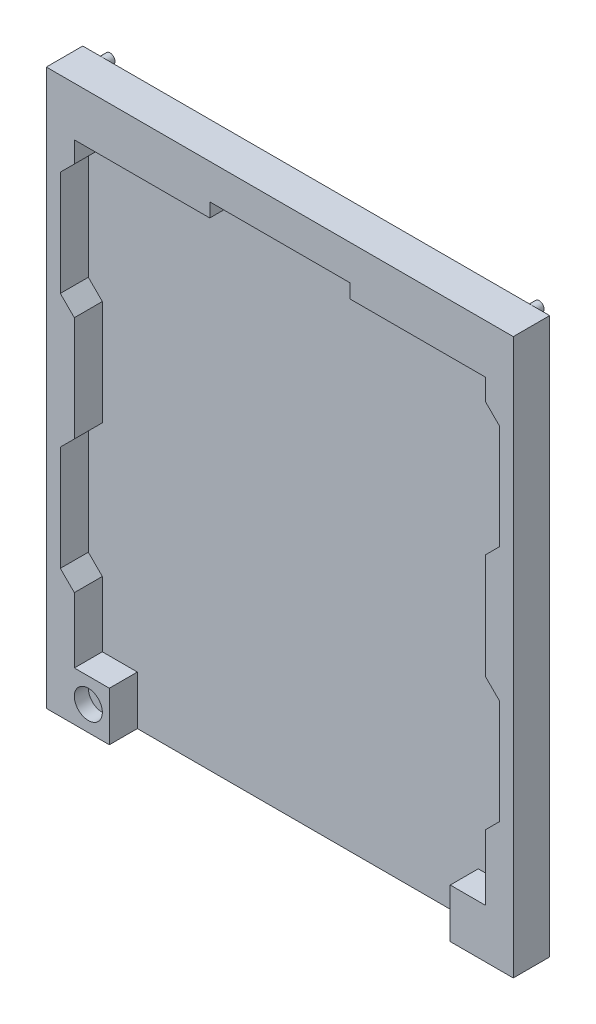
ISO-10303-21;
HEADER;
FILE_DESCRIPTION(('STEP AP214'),'2;1');
FILE_NAME('part.step','',(''),(''),'','','');
FILE_SCHEMA(('AUTOMOTIVE_DESIGN { 1 0 10303 214 1 1 1 1 }'));
ENDSEC;
DATA;
#1=APPLICATION_CONTEXT('core data for automotive mechanical design processes');
#2=APPLICATION_PROTOCOL_DEFINITION('international standard','automotive_design',2000,#1);
#3=PRODUCT_CONTEXT('',#1,'mechanical');
#4=PRODUCT('Part','Part','',(#3));
#5=PRODUCT_RELATED_PRODUCT_CATEGORY('part','',(#4));
#6=PRODUCT_DEFINITION_FORMATION('','',#4);
#7=PRODUCT_DEFINITION_CONTEXT('part definition',#1,'design');
#8=PRODUCT_DEFINITION('design','',#6,#7);
#9=PRODUCT_DEFINITION_SHAPE('','',#8);
#10=(LENGTH_UNIT() NAMED_UNIT(*) SI_UNIT(.MILLI.,.METRE.));
#11=(NAMED_UNIT(*) PLANE_ANGLE_UNIT() SI_UNIT($,.RADIAN.));
#12=(NAMED_UNIT(*) SI_UNIT($,.STERADIAN.) SOLID_ANGLE_UNIT());
#13=UNCERTAINTY_MEASURE_WITH_UNIT(LENGTH_MEASURE(1.E-05),#10,'distance_accuracy_value','');
#14=(GEOMETRIC_REPRESENTATION_CONTEXT(3) GLOBAL_UNCERTAINTY_ASSIGNED_CONTEXT((#13)) GLOBAL_UNIT_ASSIGNED_CONTEXT((#10,
#11,#12)) REPRESENTATION_CONTEXT('',''));
#15=CARTESIAN_POINT('',(0.,0.,0.));
#16=DIRECTION('',(0.,0.,1.));
#17=DIRECTION('',(1.,0.,0.));
#18=AXIS2_PLACEMENT_3D('',#15,#16,#17);
#19=CARTESIAN_POINT('',(0.,0.,0.6));
#20=DIRECTION('',(0.,0.,1.));
#21=DIRECTION('',(1.,0.,0.));
#22=AXIS2_PLACEMENT_3D('',#19,#20,#21);
#23=PLANE('',#22);
#24=DIRECTION('',(1.,0.,0.));
#25=VECTOR('',#24,1.);
#26=CARTESIAN_POINT('',(-33.34,0.,0.6));
#27=LINE('',#26,#25);
#28=CARTESIAN_POINT('',(-28.84,0.,0.6));
#29=VERTEX_POINT('',#28);
#30=CARTESIAN_POINT('',(-4.5,0.,0.6));
#31=VERTEX_POINT('',#30);
#32=EDGE_CURVE('E594',#29,#31,#27,.T.);
#33=ORIENTED_EDGE('',*,*,#32,.T.);
#34=DIRECTION('',(0.,-1.,0.));
#35=VECTOR('',#34,1.);
#36=CARTESIAN_POINT('',(-4.5,0.,0.6));
#37=LINE('',#36,#35);
#38=CARTESIAN_POINT('',(-4.5,3.5,0.6));
#39=VERTEX_POINT('',#38);
#40=EDGE_CURVE('E726',#39,#31,#37,.T.);
#41=ORIENTED_EDGE('',*,*,#40,.F.);
#42=DIRECTION('',(-1.,0.,0.));
#43=VECTOR('',#42,1.);
#44=CARTESIAN_POINT('',(0.,3.5,0.6));
#45=LINE('',#44,#43);
#46=CARTESIAN_POINT('',(-2.,3.5,0.6));
#47=VERTEX_POINT('',#46);
#48=EDGE_CURVE('E722',#47,#39,#45,.T.);
#49=ORIENTED_EDGE('',*,*,#48,.F.);
#50=DIRECTION('',(0.,-1.,0.));
#51=VECTOR('',#50,1.);
#52=CARTESIAN_POINT('',(-1.99999999999999,0.,0.6));
#53=LINE('',#52,#51);
#54=CARTESIAN_POINT('',(-2.,8.16000000000001,0.6));
#55=VERTEX_POINT('',#54);
#56=EDGE_CURVE('E718',#55,#47,#53,.T.);
#57=ORIENTED_EDGE('',*,*,#56,.F.);
#58=DIRECTION('',(-0.707106781186549,-0.707106781186547,0.));
#59=VECTOR('',#58,1.);
#60=CARTESIAN_POINT('',(-5.08,5.08000000000001,0.6));
#61=LINE('',#60,#59);
#62=CARTESIAN_POINT('',(-0.999999999999996,9.16,0.6));
#63=VERTEX_POINT('',#62);
#64=EDGE_CURVE('E634',#63,#55,#61,.T.);
#65=ORIENTED_EDGE('',*,*,#64,.F.);
#66=DIRECTION('',(0.,-1.,0.));
#67=VECTOR('',#66,1.);
#68=CARTESIAN_POINT('',(-0.999999999999995,0.,0.6));
#69=LINE('',#68,#67);
#70=CARTESIAN_POINT('',(-0.999999999999997,16.66,0.6));
#71=VERTEX_POINT('',#70);
#72=EDGE_CURVE('E630',#71,#63,#69,.T.);
#73=ORIENTED_EDGE('',*,*,#72,.F.);
#74=DIRECTION('',(0.707106781186549,-0.707106781186546,0.));
#75=VECTOR('',#74,1.);
#76=CARTESIAN_POINT('',(7.83,7.83000000000003,0.6));
#77=LINE('',#76,#75);
#78=CARTESIAN_POINT('',(-1.99999999999999,17.66,0.6));
#79=VERTEX_POINT('',#78);
#80=EDGE_CURVE('E624',#79,#71,#77,.T.);
#81=ORIENTED_EDGE('',*,*,#80,.F.);
#82=DIRECTION('',(0.,-1.,0.));
#83=VECTOR('',#82,1.);
#84=CARTESIAN_POINT('',(-1.99999999999998,0.,0.6));
#85=LINE('',#84,#83);
#86=CARTESIAN_POINT('',(-1.99999999999999,25.16,0.6));
#87=VERTEX_POINT('',#86);
#88=EDGE_CURVE('E620',#87,#79,#85,.T.);
#89=ORIENTED_EDGE('',*,*,#88,.F.);
#90=DIRECTION('',(-0.707106781186546,-0.707106781186549,0.));
#91=VECTOR('',#90,1.);
#92=CARTESIAN_POINT('',(-13.58,13.5799999999999,0.6));
#93=LINE('',#92,#91);
#94=CARTESIAN_POINT('',(-0.999999999999999,26.16,0.6));
#95=VERTEX_POINT('',#94);
#96=EDGE_CURVE('E625',#95,#87,#93,.T.);
#97=ORIENTED_EDGE('',*,*,#96,.F.);
#98=DIRECTION('',(0.,-1.,0.));
#99=VECTOR('',#98,1.);
#100=CARTESIAN_POINT('',(-0.999999999999997,0.,0.6));
#101=LINE('',#100,#99);
#102=CARTESIAN_POINT('',(-0.999999999999999,33.66,0.6));
#103=VERTEX_POINT('',#102);
#104=EDGE_CURVE('E732',#103,#95,#101,.T.);
#105=ORIENTED_EDGE('',*,*,#104,.F.);
#106=DIRECTION('',(-0.707106781186543,0.707106781186552,0.));
#107=VECTOR('',#106,1.);
#108=CARTESIAN_POINT('',(16.33,16.3299999999998,0.6));
#109=LINE('',#108,#107);
#110=CARTESIAN_POINT('',(-2.,34.66,0.6));
#111=VERTEX_POINT('',#110);
#112=EDGE_CURVE('E329',#103,#111,#109,.T.);
#113=ORIENTED_EDGE('',*,*,#112,.T.);
#114=DIRECTION('',(0.,-1.,0.));
#115=VECTOR('',#114,1.);
#116=CARTESIAN_POINT('',(-2.00000000000005,0.,0.6));
#117=LINE('',#116,#115);
#118=CARTESIAN_POINT('',(-2.,36.16,0.6));
#119=VERTEX_POINT('',#118);
#120=EDGE_CURVE('E351',#119,#111,#117,.T.);
#121=ORIENTED_EDGE('',*,*,#120,.F.);
#122=DIRECTION('',(-1.,0.,0.));
#123=VECTOR('',#122,1.);
#124=CARTESIAN_POINT('',(0.,36.16,0.6));
#125=LINE('',#124,#123);
#126=CARTESIAN_POINT('',(-11.67,36.16,0.6));
#127=VERTEX_POINT('',#126);
#128=EDGE_CURVE('E67',#119,#127,#125,.T.);
#129=ORIENTED_EDGE('',*,*,#128,.T.);
#130=DIRECTION('',(0.,1.,0.));
#131=VECTOR('',#130,1.);
#132=CARTESIAN_POINT('',(-11.67,0.,0.6));
#133=LINE('',#132,#131);
#134=CARTESIAN_POINT('',(-11.67,37.16,0.6));
#135=VERTEX_POINT('',#134);
#136=EDGE_CURVE('E978',#127,#135,#133,.T.);
#137=ORIENTED_EDGE('',*,*,#136,.T.);
#138=DIRECTION('',(-1.,0.,0.));
#139=VECTOR('',#138,1.);
#140=CARTESIAN_POINT('',(0.,37.16,0.6));
#141=LINE('',#140,#139);
#142=CARTESIAN_POINT('',(-21.67,37.16,0.6));
#143=VERTEX_POINT('',#142);
#144=EDGE_CURVE('E983',#135,#143,#141,.T.);
#145=ORIENTED_EDGE('',*,*,#144,.T.);
#146=DIRECTION('',(0.,1.,0.));
#147=VECTOR('',#146,1.);
#148=CARTESIAN_POINT('',(-21.67,0.,0.6));
#149=LINE('',#148,#147);
#150=CARTESIAN_POINT('',(-21.67,36.16,0.6));
#151=VERTEX_POINT('',#150);
#152=EDGE_CURVE('E989',#151,#143,#149,.T.);
#153=ORIENTED_EDGE('',*,*,#152,.F.);
#154=DIRECTION('',(1.,0.,0.));
#155=VECTOR('',#154,1.);
#156=CARTESIAN_POINT('',(0.,36.16,0.6));
#157=LINE('',#156,#155);
#158=CARTESIAN_POINT('',(-31.34,36.16,0.6));
#159=VERTEX_POINT('',#158);
#160=EDGE_CURVE('E1006',#159,#151,#157,.T.);
#161=ORIENTED_EDGE('',*,*,#160,.F.);
#162=DIRECTION('',(0.,-1.,0.));
#163=VECTOR('',#162,1.);
#164=CARTESIAN_POINT('',(-31.34,0.,0.6));
#165=LINE('',#164,#163);
#166=CARTESIAN_POINT('',(-31.34,34.66,0.6));
#167=VERTEX_POINT('',#166);
#168=EDGE_CURVE('E1010',#159,#167,#165,.T.);
#169=ORIENTED_EDGE('',*,*,#168,.T.);
#170=DIRECTION('',(0.707106781186548,0.707106781186548,0.));
#171=VECTOR('',#170,1.);
#172=CARTESIAN_POINT('',(-33.,33.,0.6));
#173=LINE('',#172,#171);
#174=CARTESIAN_POINT('',(-32.34,33.66,0.6));
#175=VERTEX_POINT('',#174);
#176=EDGE_CURVE('E1015',#175,#167,#173,.T.);
#177=ORIENTED_EDGE('',*,*,#176,.F.);
#178=DIRECTION('',(0.,1.,0.));
#179=VECTOR('',#178,1.);
#180=CARTESIAN_POINT('',(-32.34,0.,0.6));
#181=LINE('',#180,#179);
#182=CARTESIAN_POINT('',(-32.34,26.16,0.6));
#183=VERTEX_POINT('',#182);
#184=EDGE_CURVE('E1021',#183,#175,#181,.T.);
#185=ORIENTED_EDGE('',*,*,#184,.F.);
#186=DIRECTION('',(-0.707106781186549,0.707106781186546,0.));
#187=VECTOR('',#186,1.);
#188=CARTESIAN_POINT('',(-3.08999999999995,-3.08999999999996,0.6));
#189=LINE('',#188,#187);
#190=CARTESIAN_POINT('',(-31.34,25.16,0.6));
#191=VERTEX_POINT('',#190);
#192=EDGE_CURVE('E1024',#191,#183,#189,.T.);
#193=ORIENTED_EDGE('',*,*,#192,.F.);
#194=DIRECTION('',(0.,1.,0.));
#195=VECTOR('',#194,1.);
#196=CARTESIAN_POINT('',(-31.34,0.,0.6));
#197=LINE('',#196,#195);
#198=CARTESIAN_POINT('',(-31.34,17.66,0.6));
#199=VERTEX_POINT('',#198);
#200=EDGE_CURVE('E934',#199,#191,#197,.T.);
#201=ORIENTED_EDGE('',*,*,#200,.F.);
#202=DIRECTION('',(0.707106781186552,0.707106781186543,0.));
#203=VECTOR('',#202,1.);
#204=CARTESIAN_POINT('',(-24.4999999999998,24.5000000000001,0.6));
#205=LINE('',#204,#203);
#206=CARTESIAN_POINT('',(-32.34,16.66,0.6));
#207=VERTEX_POINT('',#206);
#208=EDGE_CURVE('E930',#207,#199,#205,.T.);
#209=ORIENTED_EDGE('',*,*,#208,.F.);
#210=DIRECTION('',(0.,1.,0.));
#211=VECTOR('',#210,1.);
#212=CARTESIAN_POINT('',(-32.34,0.,0.6));
#213=LINE('',#212,#211);
#214=CARTESIAN_POINT('',(-32.34,9.15999999999999,0.6));
#215=VERTEX_POINT('',#214);
#216=EDGE_CURVE('E926',#215,#207,#213,.T.);
#217=ORIENTED_EDGE('',*,*,#216,.F.);
#218=DIRECTION('',(-0.707106781186551,0.707106781186544,0.));
#219=VECTOR('',#218,1.);
#220=CARTESIAN_POINT('',(-11.5899999999998,-11.59,0.6));
#221=LINE('',#220,#219);
#222=CARTESIAN_POINT('',(-31.34,8.16000000000001,0.6));
#223=VERTEX_POINT('',#222);
#224=EDGE_CURVE('E862',#223,#215,#221,.T.);
#225=ORIENTED_EDGE('',*,*,#224,.F.);
#226=DIRECTION('',(0.,1.,0.));
#227=VECTOR('',#226,1.);
#228=CARTESIAN_POINT('',(-31.34,0.,0.6));
#229=LINE('',#228,#227);
#230=CARTESIAN_POINT('',(-31.34,3.5,0.6));
#231=VERTEX_POINT('',#230);
#232=EDGE_CURVE('E858',#231,#223,#229,.T.);
#233=ORIENTED_EDGE('',*,*,#232,.F.);
#234=DIRECTION('',(-1.,0.,0.));
#235=VECTOR('',#234,1.);
#236=CARTESIAN_POINT('',(0.,3.49999999999999,0.6));
#237=LINE('',#236,#235);
#238=CARTESIAN_POINT('',(-28.84,3.5,0.6));
#239=VERTEX_POINT('',#238);
#240=EDGE_CURVE('E854',#239,#231,#237,.T.);
#241=ORIENTED_EDGE('',*,*,#240,.F.);
#242=DIRECTION('',(0.,1.,0.));
#243=VECTOR('',#242,1.);
#244=CARTESIAN_POINT('',(-28.84,0.,0.6));
#245=LINE('',#244,#243);
#246=EDGE_CURVE('E851',#29,#239,#245,.T.);
#247=ORIENTED_EDGE('',*,*,#246,.F.);
#248=EDGE_LOOP('',(#33,#41,#49,#57,#65,#73,#81,#89,#97,#105,#113,#121,#129,#137,#145,#153,#161,
#169,#177,#185,#193,#201,#209,#217,#225,#233,#241,#247));
#249=FACE_BOUND('',#248,.T.);
#250=ADVANCED_FACE('F47',(#249),#23,.T.);
#251=CARTESIAN_POINT('',(-33.34,39.66,0.6));
#252=DIRECTION('',(1.,0.,0.));
#253=DIRECTION('',(0.,1.,0.));
#254=AXIS2_PLACEMENT_3D('',#251,#252,#253);
#255=PLANE('',#254);
#256=DIRECTION('',(0.,-1.,0.));
#257=VECTOR('',#256,1.);
#258=CARTESIAN_POINT('',(-33.34,39.66,0.));
#259=LINE('',#258,#257);
#260=CARTESIAN_POINT('',(-33.34,39.66,0.));
#261=VERTEX_POINT('',#260);
#262=CARTESIAN_POINT('',(-33.34,0.,0.));
#263=VERTEX_POINT('',#262);
#264=EDGE_CURVE('E333',#261,#263,#259,.T.);
#265=ORIENTED_EDGE('',*,*,#264,.T.);
#266=DIRECTION('',(0.,0.,-1.));
#267=VECTOR('',#266,1.);
#268=CARTESIAN_POINT('',(-33.34,0.,0.6));
#269=LINE('',#268,#267);
#270=CARTESIAN_POINT('',(-33.34,0.,2.6));
#271=VERTEX_POINT('',#270);
#272=EDGE_CURVE('E576',#271,#263,#269,.T.);
#273=ORIENTED_EDGE('',*,*,#272,.F.);
#274=DIRECTION('',(0.,-1.,0.));
#275=VECTOR('',#274,1.);
#276=CARTESIAN_POINT('',(-33.34,0.,2.6));
#277=LINE('',#276,#275);
#278=CARTESIAN_POINT('',(-33.34,39.66,2.6));
#279=VERTEX_POINT('',#278);
#280=EDGE_CURVE('E819',#279,#271,#277,.T.);
#281=ORIENTED_EDGE('',*,*,#280,.F.);
#282=DIRECTION('',(0.,0.,-1.));
#283=VECTOR('',#282,1.);
#284=CARTESIAN_POINT('',(-33.34,39.66,0.6));
#285=LINE('',#284,#283);
#286=EDGE_CURVE('E610',#279,#261,#285,.T.);
#287=ORIENTED_EDGE('',*,*,#286,.T.);
#288=EDGE_LOOP('',(#265,#273,#281,#287));
#289=FACE_BOUND('',#288,.T.);
#290=ADVANCED_FACE('F50',(#289),#255,.F.);
#291=CARTESIAN_POINT('',(-33.34,0.,0.6));
#292=DIRECTION('',(0.,1.,0.));
#293=DIRECTION('',(0.,0.,1.));
#294=AXIS2_PLACEMENT_3D('',#291,#292,#293);
#295=PLANE('',#294);
#296=DIRECTION('',(1.,0.,0.));
#297=VECTOR('',#296,1.);
#298=CARTESIAN_POINT('',(-33.34,0.,0.));
#299=LINE('',#298,#297);
#300=CARTESIAN_POINT('',(0.,0.,0.));
#301=VERTEX_POINT('',#300);
#302=EDGE_CURVE('E570',#263,#301,#299,.T.);
#303=ORIENTED_EDGE('',*,*,#302,.T.);
#304=DIRECTION('',(0.,0.,-1.));
#305=VECTOR('',#304,1.);
#306=CARTESIAN_POINT('',(0.,0.,0.6));
#307=LINE('',#306,#305);
#308=CARTESIAN_POINT('',(0.,0.,2.6));
#309=VERTEX_POINT('',#308);
#310=EDGE_CURVE('E573',#309,#301,#307,.T.);
#311=ORIENTED_EDGE('',*,*,#310,.F.);
#312=DIRECTION('',(1.,0.,0.));
#313=VECTOR('',#312,1.);
#314=CARTESIAN_POINT('',(0.,0.,2.6));
#315=LINE('',#314,#313);
#316=CARTESIAN_POINT('',(-4.5,0.,2.6));
#317=VERTEX_POINT('',#316);
#318=EDGE_CURVE('E691',#317,#309,#315,.T.);
#319=ORIENTED_EDGE('',*,*,#318,.F.);
#320=DIRECTION('',(0.,0.,-1.));
#321=VECTOR('',#320,1.);
#322=CARTESIAN_POINT('',(-4.5,0.,2.6));
#323=LINE('',#322,#321);
#324=EDGE_CURVE('E755',#317,#31,#323,.T.);
#325=ORIENTED_EDGE('',*,*,#324,.T.);
#326=ORIENTED_EDGE('',*,*,#32,.F.);
#327=DIRECTION('',(0.,0.,-1.));
#328=VECTOR('',#327,1.);
#329=CARTESIAN_POINT('',(-28.84,0.,2.6));
#330=LINE('',#329,#328);
#331=CARTESIAN_POINT('',(-28.84,0.,2.6));
#332=VERTEX_POINT('',#331);
#333=EDGE_CURVE('E810',#332,#29,#330,.T.);
#334=ORIENTED_EDGE('',*,*,#333,.F.);
#335=EDGE_CURVE('E695',#271,#332,#315,.T.);
#336=ORIENTED_EDGE('',*,*,#335,.F.);
#337=ORIENTED_EDGE('',*,*,#272,.T.);
#338=EDGE_LOOP('',(#303,#311,#319,#325,#326,#334,#336,#337));
#339=FACE_BOUND('',#338,.T.);
#340=ADVANCED_FACE('F538',(#339),#295,.F.);
#341=CARTESIAN_POINT('',(0.,39.66,0.6));
#342=DIRECTION('',(-1.,0.,0.));
#343=DIRECTION('',(0.,-1.,0.));
#344=AXIS2_PLACEMENT_3D('',#341,#342,#343);
#345=PLANE('',#344);
#346=DIRECTION('',(0.,1.,0.));
#347=VECTOR('',#346,1.);
#348=CARTESIAN_POINT('',(0.,39.66,0.));
#349=LINE('',#348,#347);
#350=CARTESIAN_POINT('',(0.,39.66,0.));
#351=VERTEX_POINT('',#350);
#352=EDGE_CURVE('E582',#301,#351,#349,.T.);
#353=ORIENTED_EDGE('',*,*,#352,.T.);
#354=DIRECTION('',(0.,0.,-1.));
#355=VECTOR('',#354,1.);
#356=CARTESIAN_POINT('',(0.,39.66,0.6));
#357=LINE('',#356,#355);
#358=CARTESIAN_POINT('',(0.,39.66,2.6));
#359=VERTEX_POINT('',#358);
#360=EDGE_CURVE('E588',#359,#351,#357,.T.);
#361=ORIENTED_EDGE('',*,*,#360,.F.);
#362=DIRECTION('',(0.,1.,0.));
#363=VECTOR('',#362,1.);
#364=CARTESIAN_POINT('',(0.,0.,2.6));
#365=LINE('',#364,#363);
#366=EDGE_CURVE('E586',#309,#359,#365,.T.);
#367=ORIENTED_EDGE('',*,*,#366,.F.);
#368=ORIENTED_EDGE('',*,*,#310,.T.);
#369=EDGE_LOOP('',(#353,#361,#367,#368));
#370=FACE_BOUND('',#369,.T.);
#371=ADVANCED_FACE('F557',(#370),#345,.F.);
#372=CARTESIAN_POINT('',(-33.34,39.66,0.6));
#373=DIRECTION('',(0.,-1.,0.));
#374=DIRECTION('',(1.,0.,0.));
#375=AXIS2_PLACEMENT_3D('',#372,#373,#374);
#376=PLANE('',#375);
#377=DIRECTION('',(-1.,0.,0.));
#378=VECTOR('',#377,1.);
#379=CARTESIAN_POINT('',(-33.34,39.66,0.));
#380=LINE('',#379,#378);
#381=EDGE_CURVE('E78',#351,#261,#380,.T.);
#382=ORIENTED_EDGE('',*,*,#381,.T.);
#383=ORIENTED_EDGE('',*,*,#286,.F.);
#384=DIRECTION('',(-1.,0.,0.));
#385=VECTOR('',#384,1.);
#386=CARTESIAN_POINT('',(0.,39.66,2.6));
#387=LINE('',#386,#385);
#388=EDGE_CURVE('E815',#359,#279,#387,.T.);
#389=ORIENTED_EDGE('',*,*,#388,.F.);
#390=ORIENTED_EDGE('',*,*,#360,.T.);
#391=EDGE_LOOP('',(#382,#383,#389,#390));
#392=FACE_BOUND('',#391,.T.);
#393=ADVANCED_FACE('F551',(#392),#376,.F.);
#394=CARTESIAN_POINT('',(0.,0.,0.));
#395=DIRECTION('',(0.,0.,1.));
#396=DIRECTION('',(1.,0.,0.));
#397=AXIS2_PLACEMENT_3D('',#394,#395,#396);
#398=PLANE('',#397);
#399=CARTESIAN_POINT('',(-31.99,39.26,0.));
#400=DIRECTION('',(0.,0.,1.));
#401=DIRECTION('',(1.,0.,0.));
#402=AXIS2_PLACEMENT_3D('',#399,#400,#401);
#403=CIRCLE('',#402,0.350000000000002);
#404=CARTESIAN_POINT('',(-31.64,39.26,0.));
#405=VERTEX_POINT('',#404);
#406=EDGE_CURVE('E12',#405,#405,#403,.F.);
#407=ORIENTED_EDGE('',*,*,#406,.F.);
#408=EDGE_LOOP('',(#407));
#409=FACE_BOUND('',#408,.T.);
#410=CARTESIAN_POINT('',(-1.35,39.26,0.));
#411=DIRECTION('',(0.,0.,1.));
#412=DIRECTION('',(1.,0.,0.));
#413=AXIS2_PLACEMENT_3D('',#410,#411,#412);
#414=CIRCLE('',#413,0.350000000000002);
#415=CARTESIAN_POINT('',(-0.999999999999998,39.26,0.));
#416=VERTEX_POINT('',#415);
#417=EDGE_CURVE('E57',#416,#416,#414,.F.);
#418=ORIENTED_EDGE('',*,*,#417,.F.);
#419=EDGE_LOOP('',(#418));
#420=FACE_BOUND('',#419,.T.);
#421=ORIENTED_EDGE('',*,*,#264,.F.);
#422=ORIENTED_EDGE('',*,*,#381,.F.);
#423=ORIENTED_EDGE('',*,*,#352,.F.);
#424=ORIENTED_EDGE('',*,*,#302,.F.);
#425=EDGE_LOOP('',(#421,#422,#423,#424));
#426=FACE_BOUND('',#425,.T.);
#427=ADVANCED_FACE('F547',(#409,#420,#426),#398,.F.);
#428=CARTESIAN_POINT('',(16.33,16.3299999999998,2.6));
#429=DIRECTION('',(-0.707106781186552,-0.707106781186543,0.));
#430=DIRECTION('',(0.707106781186543,-0.707106781186552,0.));
#431=AXIS2_PLACEMENT_3D('',#428,#429,#430);
#432=PLANE('',#431);
#433=ORIENTED_EDGE('',*,*,#112,.F.);
#434=DIRECTION('',(0.,0.,-1.));
#435=VECTOR('',#434,1.);
#436=CARTESIAN_POINT('',(-0.999999999999999,33.66,2.6));
#437=LINE('',#436,#435);
#438=CARTESIAN_POINT('',(-0.999999999999999,33.66,2.6));
#439=VERTEX_POINT('',#438);
#440=EDGE_CURVE('E323',#439,#103,#437,.T.);
#441=ORIENTED_EDGE('',*,*,#440,.F.);
#442=DIRECTION('',(-0.707106781186543,0.707106781186552,0.));
#443=VECTOR('',#442,1.);
#444=CARTESIAN_POINT('',(16.33,16.3299999999998,2.6));
#445=LINE('',#444,#443);
#446=CARTESIAN_POINT('',(-2.,34.66,2.6));
#447=VERTEX_POINT('',#446);
#448=EDGE_CURVE('E327',#439,#447,#445,.T.);
#449=ORIENTED_EDGE('',*,*,#448,.T.);
#450=DIRECTION('',(0.,0.,-1.));
#451=VECTOR('',#450,1.);
#452=CARTESIAN_POINT('',(-2.,34.66,2.6));
#453=LINE('',#452,#451);
#454=EDGE_CURVE('E372',#447,#111,#453,.T.);
#455=ORIENTED_EDGE('',*,*,#454,.T.);
#456=EDGE_LOOP('',(#433,#441,#449,#455));
#457=FACE_BOUND('',#456,.T.);
#458=ADVANCED_FACE('F325',(#457),#432,.T.);
#459=CARTESIAN_POINT('',(-0.999999999999997,0.,2.6));
#460=DIRECTION('',(1.,0.,0.));
#461=DIRECTION('',(0.,1.,0.));
#462=AXIS2_PLACEMENT_3D('',#459,#460,#461);
#463=PLANE('',#462);
#464=ORIENTED_EDGE('',*,*,#104,.T.);
#465=DIRECTION('',(0.,0.,-1.));
#466=VECTOR('',#465,1.);
#467=CARTESIAN_POINT('',(-0.999999999999999,26.16,2.6));
#468=LINE('',#467,#466);
#469=CARTESIAN_POINT('',(-0.999999999999999,26.16,2.6));
#470=VERTEX_POINT('',#469);
#471=EDGE_CURVE('E334',#470,#95,#468,.T.);
#472=ORIENTED_EDGE('',*,*,#471,.F.);
#473=DIRECTION('',(0.,-1.,0.));
#474=VECTOR('',#473,1.);
#475=CARTESIAN_POINT('',(-0.999999999999997,0.,2.6));
#476=LINE('',#475,#474);
#477=EDGE_CURVE('E337',#439,#470,#476,.T.);
#478=ORIENTED_EDGE('',*,*,#477,.F.);
#479=ORIENTED_EDGE('',*,*,#440,.T.);
#480=EDGE_LOOP('',(#464,#472,#478,#479));
#481=FACE_BOUND('',#480,.T.);
#482=ADVANCED_FACE('F338',(#481),#463,.F.);
#483=CARTESIAN_POINT('',(-13.58,13.5799999999999,2.6));
#484=DIRECTION('',(0.707106781186549,-0.707106781186546,0.));
#485=DIRECTION('',(0.707106781186546,0.707106781186549,0.));
#486=AXIS2_PLACEMENT_3D('',#483,#484,#485);
#487=PLANE('',#486);
#488=ORIENTED_EDGE('',*,*,#96,.T.);
#489=DIRECTION('',(0.,0.,-1.));
#490=VECTOR('',#489,1.);
#491=CARTESIAN_POINT('',(-1.99999999999999,25.16,2.6));
#492=LINE('',#491,#490);
#493=CARTESIAN_POINT('',(-1.99999999999999,25.16,2.6));
#494=VERTEX_POINT('',#493);
#495=EDGE_CURVE('E713',#494,#87,#492,.T.);
#496=ORIENTED_EDGE('',*,*,#495,.F.);
#497=DIRECTION('',(-0.707106781186546,-0.707106781186549,0.));
#498=VECTOR('',#497,1.);
#499=CARTESIAN_POINT('',(-13.58,13.5799999999999,2.6));
#500=LINE('',#499,#498);
#501=EDGE_CURVE('E343',#470,#494,#500,.T.);
#502=ORIENTED_EDGE('',*,*,#501,.F.);
#503=ORIENTED_EDGE('',*,*,#471,.T.);
#504=EDGE_LOOP('',(#488,#496,#502,#503));
#505=FACE_BOUND('',#504,.T.);
#506=ADVANCED_FACE('F772',(#505),#487,.F.);
#507=CARTESIAN_POINT('',(-1.99999999999998,0.,2.6));
#508=DIRECTION('',(1.,0.,0.));
#509=DIRECTION('',(0.,1.,0.));
#510=AXIS2_PLACEMENT_3D('',#507,#508,#509);
#511=PLANE('',#510);
#512=ORIENTED_EDGE('',*,*,#88,.T.);
#513=DIRECTION('',(0.,0.,-1.));
#514=VECTOR('',#513,1.);
#515=CARTESIAN_POINT('',(-1.99999999999999,17.66,2.6));
#516=LINE('',#515,#514);
#517=CARTESIAN_POINT('',(-1.99999999999999,17.66,2.6));
#518=VERTEX_POINT('',#517);
#519=EDGE_CURVE('E657',#518,#79,#516,.T.);
#520=ORIENTED_EDGE('',*,*,#519,.F.);
#521=DIRECTION('',(0.,-1.,0.));
#522=VECTOR('',#521,1.);
#523=CARTESIAN_POINT('',(-1.99999999999998,0.,2.6));
#524=LINE('',#523,#522);
#525=EDGE_CURVE('E664',#494,#518,#524,.T.);
#526=ORIENTED_EDGE('',*,*,#525,.F.);
#527=ORIENTED_EDGE('',*,*,#495,.T.);
#528=EDGE_LOOP('',(#512,#520,#526,#527));
#529=FACE_BOUND('',#528,.T.);
#530=ADVANCED_FACE('F776',(#529),#511,.F.);
#531=CARTESIAN_POINT('',(7.83,7.83000000000003,2.6));
#532=DIRECTION('',(0.707106781186546,0.707106781186549,0.));
#533=DIRECTION('',(-0.707106781186549,0.707106781186546,0.));
#534=AXIS2_PLACEMENT_3D('',#531,#532,#533);
#535=PLANE('',#534);
#536=ORIENTED_EDGE('',*,*,#80,.T.);
#537=DIRECTION('',(0.,0.,-1.));
#538=VECTOR('',#537,1.);
#539=CARTESIAN_POINT('',(-0.999999999999997,16.66,2.6));
#540=LINE('',#539,#538);
#541=CARTESIAN_POINT('',(-0.999999999999997,16.66,2.6));
#542=VERTEX_POINT('',#541);
#543=EDGE_CURVE('E650',#542,#71,#540,.T.);
#544=ORIENTED_EDGE('',*,*,#543,.F.);
#545=DIRECTION('',(0.707106781186549,-0.707106781186546,0.));
#546=VECTOR('',#545,1.);
#547=CARTESIAN_POINT('',(7.83,7.83000000000003,2.6));
#548=LINE('',#547,#546);
#549=EDGE_CURVE('E660',#518,#542,#548,.T.);
#550=ORIENTED_EDGE('',*,*,#549,.F.);
#551=ORIENTED_EDGE('',*,*,#519,.T.);
#552=EDGE_LOOP('',(#536,#544,#550,#551));
#553=FACE_BOUND('',#552,.T.);
#554=ADVANCED_FACE('F781',(#553),#535,.F.);
#555=CARTESIAN_POINT('',(-0.999999999999995,0.,2.6));
#556=DIRECTION('',(1.,0.,0.));
#557=DIRECTION('',(0.,1.,0.));
#558=AXIS2_PLACEMENT_3D('',#555,#556,#557);
#559=PLANE('',#558);
#560=ORIENTED_EDGE('',*,*,#72,.T.);
#561=DIRECTION('',(0.,0.,-1.));
#562=VECTOR('',#561,1.);
#563=CARTESIAN_POINT('',(-0.999999999999996,9.16,2.6));
#564=LINE('',#563,#562);
#565=CARTESIAN_POINT('',(-0.999999999999996,9.16,2.6));
#566=VERTEX_POINT('',#565);
#567=EDGE_CURVE('E644',#566,#63,#564,.T.);
#568=ORIENTED_EDGE('',*,*,#567,.F.);
#569=DIRECTION('',(0.,-1.,0.));
#570=VECTOR('',#569,1.);
#571=CARTESIAN_POINT('',(-0.999999999999995,0.,2.6));
#572=LINE('',#571,#570);
#573=EDGE_CURVE('E663',#542,#566,#572,.T.);
#574=ORIENTED_EDGE('',*,*,#573,.F.);
#575=ORIENTED_EDGE('',*,*,#543,.T.);
#576=EDGE_LOOP('',(#560,#568,#574,#575));
#577=FACE_BOUND('',#576,.T.);
#578=ADVANCED_FACE('F787',(#577),#559,.F.);
#579=CARTESIAN_POINT('',(-5.08,5.08000000000001,2.6));
#580=DIRECTION('',(0.707106781186547,-0.707106781186549,0.));
#581=DIRECTION('',(0.707106781186549,0.707106781186547,0.));
#582=AXIS2_PLACEMENT_3D('',#579,#580,#581);
#583=PLANE('',#582);
#584=ORIENTED_EDGE('',*,*,#64,.T.);
#585=DIRECTION('',(0.,0.,-1.));
#586=VECTOR('',#585,1.);
#587=CARTESIAN_POINT('',(-2.,8.16000000000001,2.6));
#588=LINE('',#587,#586);
#589=CARTESIAN_POINT('',(-2.,8.16000000000001,2.6));
#590=VERTEX_POINT('',#589);
#591=EDGE_CURVE('E651',#590,#55,#588,.T.);
#592=ORIENTED_EDGE('',*,*,#591,.F.);
#593=DIRECTION('',(-0.707106781186549,-0.707106781186547,0.));
#594=VECTOR('',#593,1.);
#595=CARTESIAN_POINT('',(-5.08,5.08000000000001,2.6));
#596=LINE('',#595,#594);
#597=EDGE_CURVE('E669',#566,#590,#596,.T.);
#598=ORIENTED_EDGE('',*,*,#597,.F.);
#599=ORIENTED_EDGE('',*,*,#567,.T.);
#600=EDGE_LOOP('',(#584,#592,#598,#599));
#601=FACE_BOUND('',#600,.T.);
#602=ADVANCED_FACE('F791',(#601),#583,.F.);
#603=CARTESIAN_POINT('',(-1.99999999999999,0.,2.6));
#604=DIRECTION('',(1.,0.,0.));
#605=DIRECTION('',(0.,1.,0.));
#606=AXIS2_PLACEMENT_3D('',#603,#604,#605);
#607=PLANE('',#606);
#608=ORIENTED_EDGE('',*,*,#56,.T.);
#609=DIRECTION('',(0.,0.,-1.));
#610=VECTOR('',#609,1.);
#611=CARTESIAN_POINT('',(-2.,3.5,2.6));
#612=LINE('',#611,#610);
#613=CARTESIAN_POINT('',(-2.,3.5,2.6));
#614=VERTEX_POINT('',#613);
#615=EDGE_CURVE('E754',#614,#47,#612,.T.);
#616=ORIENTED_EDGE('',*,*,#615,.F.);
#617=DIRECTION('',(0.,-1.,0.));
#618=VECTOR('',#617,1.);
#619=CARTESIAN_POINT('',(-1.99999999999999,0.,2.6));
#620=LINE('',#619,#618);
#621=EDGE_CURVE('E673',#590,#614,#620,.T.);
#622=ORIENTED_EDGE('',*,*,#621,.F.);
#623=ORIENTED_EDGE('',*,*,#591,.T.);
#624=EDGE_LOOP('',(#608,#616,#622,#623));
#625=FACE_BOUND('',#624,.T.);
#626=ADVANCED_FACE('F796',(#625),#607,.F.);
#627=CARTESIAN_POINT('',(0.,3.5,2.6));
#628=DIRECTION('',(0.,-1.,0.));
#629=DIRECTION('',(1.,0.,0.));
#630=AXIS2_PLACEMENT_3D('',#627,#628,#629);
#631=PLANE('',#630);
#632=ORIENTED_EDGE('',*,*,#48,.T.);
#633=DIRECTION('',(0.,0.,-1.));
#634=VECTOR('',#633,1.);
#635=CARTESIAN_POINT('',(-4.5,3.5,2.6));
#636=LINE('',#635,#634);
#637=CARTESIAN_POINT('',(-4.5,3.5,2.6));
#638=VERTEX_POINT('',#637);
#639=EDGE_CURVE('E751',#638,#39,#636,.T.);
#640=ORIENTED_EDGE('',*,*,#639,.F.);
#641=DIRECTION('',(-1.,0.,0.));
#642=VECTOR('',#641,1.);
#643=CARTESIAN_POINT('',(0.,3.5,2.6));
#644=LINE('',#643,#642);
#645=EDGE_CURVE('E679',#614,#638,#644,.T.);
#646=ORIENTED_EDGE('',*,*,#645,.F.);
#647=ORIENTED_EDGE('',*,*,#615,.T.);
#648=EDGE_LOOP('',(#632,#640,#646,#647));
#649=FACE_BOUND('',#648,.T.);
#650=ADVANCED_FACE('F802',(#649),#631,.F.);
#651=CARTESIAN_POINT('',(-4.5,0.,2.6));
#652=DIRECTION('',(1.,0.,0.));
#653=DIRECTION('',(0.,0.,-1.));
#654=AXIS2_PLACEMENT_3D('',#651,#652,#653);
#655=PLANE('',#654);
#656=ORIENTED_EDGE('',*,*,#40,.T.);
#657=ORIENTED_EDGE('',*,*,#324,.F.);
#658=DIRECTION('',(0.,-1.,0.));
#659=VECTOR('',#658,1.);
#660=CARTESIAN_POINT('',(-4.5,0.,2.6));
#661=LINE('',#660,#659);
#662=EDGE_CURVE('E694',#638,#317,#661,.T.);
#663=ORIENTED_EDGE('',*,*,#662,.F.);
#664=ORIENTED_EDGE('',*,*,#639,.T.);
#665=EDGE_LOOP('',(#656,#657,#663,#664));
#666=FACE_BOUND('',#665,.T.);
#667=ADVANCED_FACE('F806',(#666),#655,.F.);
#668=CARTESIAN_POINT('',(-28.84,0.,2.6));
#669=DIRECTION('',(-1.,0.,0.));
#670=DIRECTION('',(0.,0.,1.));
#671=AXIS2_PLACEMENT_3D('',#668,#669,#670);
#672=PLANE('',#671);
#673=ORIENTED_EDGE('',*,*,#246,.T.);
#674=DIRECTION('',(0.,0.,-1.));
#675=VECTOR('',#674,1.);
#676=CARTESIAN_POINT('',(-28.84,3.5,2.6));
#677=LINE('',#676,#675);
#678=CARTESIAN_POINT('',(-28.84,3.5,2.6));
#679=VERTEX_POINT('',#678);
#680=EDGE_CURVE('E842',#679,#239,#677,.T.);
#681=ORIENTED_EDGE('',*,*,#680,.F.);
#682=DIRECTION('',(0.,1.,0.));
#683=VECTOR('',#682,1.);
#684=CARTESIAN_POINT('',(-28.84,0.,2.6));
#685=LINE('',#684,#683);
#686=EDGE_CURVE('E825',#332,#679,#685,.T.);
#687=ORIENTED_EDGE('',*,*,#686,.F.);
#688=ORIENTED_EDGE('',*,*,#333,.T.);
#689=EDGE_LOOP('',(#673,#681,#687,#688));
#690=FACE_BOUND('',#689,.T.);
#691=ADVANCED_FACE('F1112',(#690),#672,.F.);
#692=CARTESIAN_POINT('',(0.,3.49999999999999,2.6));
#693=DIRECTION('',(0.,-1.,0.));
#694=DIRECTION('',(1.,0.,0.));
#695=AXIS2_PLACEMENT_3D('',#692,#693,#694);
#696=PLANE('',#695);
#697=ORIENTED_EDGE('',*,*,#240,.T.);
#698=DIRECTION('',(0.,0.,-1.));
#699=VECTOR('',#698,1.);
#700=CARTESIAN_POINT('',(-31.34,3.5,2.6));
#701=LINE('',#700,#699);
#702=CARTESIAN_POINT('',(-31.34,3.5,2.6));
#703=VERTEX_POINT('',#702);
#704=EDGE_CURVE('E876',#703,#231,#701,.T.);
#705=ORIENTED_EDGE('',*,*,#704,.F.);
#706=DIRECTION('',(-1.,0.,0.));
#707=VECTOR('',#706,1.);
#708=CARTESIAN_POINT('',(0.,3.49999999999999,2.6));
#709=LINE('',#708,#707);
#710=EDGE_CURVE('E829',#679,#703,#709,.T.);
#711=ORIENTED_EDGE('',*,*,#710,.F.);
#712=ORIENTED_EDGE('',*,*,#680,.T.);
#713=EDGE_LOOP('',(#697,#705,#711,#712));
#714=FACE_BOUND('',#713,.T.);
#715=ADVANCED_FACE('F895',(#714),#696,.F.);
#716=CARTESIAN_POINT('',(-31.34,0.,2.6));
#717=DIRECTION('',(-1.,0.,0.));
#718=DIRECTION('',(0.,0.,1.));
#719=AXIS2_PLACEMENT_3D('',#716,#717,#718);
#720=PLANE('',#719);
#721=ORIENTED_EDGE('',*,*,#232,.T.);
#722=DIRECTION('',(0.,0.,-1.));
#723=VECTOR('',#722,1.);
#724=CARTESIAN_POINT('',(-31.34,8.16000000000001,2.6));
#725=LINE('',#724,#723);
#726=CARTESIAN_POINT('',(-31.34,8.16000000000001,2.6));
#727=VERTEX_POINT('',#726);
#728=EDGE_CURVE('E871',#727,#223,#725,.T.);
#729=ORIENTED_EDGE('',*,*,#728,.F.);
#730=DIRECTION('',(0.,1.,0.));
#731=VECTOR('',#730,1.);
#732=CARTESIAN_POINT('',(-31.34,0.,2.6));
#733=LINE('',#732,#731);
#734=EDGE_CURVE('E912',#703,#727,#733,.T.);
#735=ORIENTED_EDGE('',*,*,#734,.F.);
#736=ORIENTED_EDGE('',*,*,#704,.T.);
#737=EDGE_LOOP('',(#721,#729,#735,#736));
#738=FACE_BOUND('',#737,.T.);
#739=ADVANCED_FACE('F902',(#738),#720,.F.);
#740=CARTESIAN_POINT('',(-11.5899999999998,-11.59,2.6));
#741=DIRECTION('',(-0.707106781186544,-0.707106781186551,0.));
#742=DIRECTION('',(0.707106781186551,-0.707106781186544,0.));
#743=AXIS2_PLACEMENT_3D('',#740,#741,#742);
#744=PLANE('',#743);
#745=ORIENTED_EDGE('',*,*,#224,.T.);
#746=DIRECTION('',(0.,0.,-1.));
#747=VECTOR('',#746,1.);
#748=CARTESIAN_POINT('',(-32.34,9.15999999999999,2.6));
#749=LINE('',#748,#747);
#750=CARTESIAN_POINT('',(-32.34,9.15999999999999,2.6));
#751=VERTEX_POINT('',#750);
#752=EDGE_CURVE('E877',#751,#215,#749,.T.);
#753=ORIENTED_EDGE('',*,*,#752,.F.);
#754=DIRECTION('',(-0.707106781186551,0.707106781186544,0.));
#755=VECTOR('',#754,1.);
#756=CARTESIAN_POINT('',(-11.5899999999998,-11.59,2.6));
#757=LINE('',#756,#755);
#758=EDGE_CURVE('E908',#727,#751,#757,.T.);
#759=ORIENTED_EDGE('',*,*,#758,.F.);
#760=ORIENTED_EDGE('',*,*,#728,.T.);
#761=EDGE_LOOP('',(#745,#753,#759,#760));
#762=FACE_BOUND('',#761,.T.);
#763=ADVANCED_FACE('F905',(#762),#744,.F.);
#764=CARTESIAN_POINT('',(-32.34,0.,2.6));
#765=DIRECTION('',(-1.,0.,0.));
#766=DIRECTION('',(0.,0.,1.));
#767=AXIS2_PLACEMENT_3D('',#764,#765,#766);
#768=PLANE('',#767);
#769=ORIENTED_EDGE('',*,*,#216,.T.);
#770=DIRECTION('',(0.,0.,-1.));
#771=VECTOR('',#770,1.);
#772=CARTESIAN_POINT('',(-32.34,16.66,2.6));
#773=LINE('',#772,#771);
#774=CARTESIAN_POINT('',(-32.34,16.66,2.6));
#775=VERTEX_POINT('',#774);
#776=EDGE_CURVE('E944',#775,#207,#773,.T.);
#777=ORIENTED_EDGE('',*,*,#776,.F.);
#778=DIRECTION('',(0.,1.,0.));
#779=VECTOR('',#778,1.);
#780=CARTESIAN_POINT('',(-32.34,0.,2.6));
#781=LINE('',#780,#779);
#782=EDGE_CURVE('E911',#751,#775,#781,.T.);
#783=ORIENTED_EDGE('',*,*,#782,.F.);
#784=ORIENTED_EDGE('',*,*,#752,.T.);
#785=EDGE_LOOP('',(#769,#777,#783,#784));
#786=FACE_BOUND('',#785,.T.);
#787=ADVANCED_FACE('F954',(#786),#768,.F.);
#788=CARTESIAN_POINT('',(-24.4999999999998,24.5000000000001,2.6));
#789=DIRECTION('',(-0.707106781186543,0.707106781186552,0.));
#790=DIRECTION('',(-0.707106781186552,-0.707106781186543,0.));
#791=AXIS2_PLACEMENT_3D('',#788,#789,#790);
#792=PLANE('',#791);
#793=ORIENTED_EDGE('',*,*,#208,.T.);
#794=DIRECTION('',(0.,0.,-1.));
#795=VECTOR('',#794,1.);
#796=CARTESIAN_POINT('',(-31.34,17.66,2.6));
#797=LINE('',#796,#795);
#798=CARTESIAN_POINT('',(-31.34,17.66,2.6));
#799=VERTEX_POINT('',#798);
#800=EDGE_CURVE('E940',#799,#199,#797,.T.);
#801=ORIENTED_EDGE('',*,*,#800,.F.);
#802=DIRECTION('',(0.707106781186552,0.707106781186543,0.));
#803=VECTOR('',#802,1.);
#804=CARTESIAN_POINT('',(-24.4999999999998,24.5000000000001,2.6));
#805=LINE('',#804,#803);
#806=EDGE_CURVE('E916',#775,#799,#805,.T.);
#807=ORIENTED_EDGE('',*,*,#806,.F.);
#808=ORIENTED_EDGE('',*,*,#776,.T.);
#809=EDGE_LOOP('',(#793,#801,#807,#808));
#810=FACE_BOUND('',#809,.T.);
#811=ADVANCED_FACE('F958',(#810),#792,.F.);
#812=CARTESIAN_POINT('',(-31.34,0.,2.6));
#813=DIRECTION('',(-1.,0.,0.));
#814=DIRECTION('',(0.,-1.,0.));
#815=AXIS2_PLACEMENT_3D('',#812,#813,#814);
#816=PLANE('',#815);
#817=ORIENTED_EDGE('',*,*,#200,.T.);
#818=DIRECTION('',(0.,0.,-1.));
#819=VECTOR('',#818,1.);
#820=CARTESIAN_POINT('',(-31.34,25.16,2.6));
#821=LINE('',#820,#819);
#822=CARTESIAN_POINT('',(-31.34,25.16,2.6));
#823=VERTEX_POINT('',#822);
#824=EDGE_CURVE('E406',#823,#191,#821,.T.);
#825=ORIENTED_EDGE('',*,*,#824,.F.);
#826=DIRECTION('',(0.,1.,0.));
#827=VECTOR('',#826,1.);
#828=CARTESIAN_POINT('',(-31.34,0.,2.6));
#829=LINE('',#828,#827);
#830=EDGE_CURVE('E424',#799,#823,#829,.T.);
#831=ORIENTED_EDGE('',*,*,#830,.F.);
#832=ORIENTED_EDGE('',*,*,#800,.T.);
#833=EDGE_LOOP('',(#817,#825,#831,#832));
#834=FACE_BOUND('',#833,.T.);
#835=ADVANCED_FACE('F961',(#834),#816,.F.);
#836=CARTESIAN_POINT('',(-3.08999999999995,-3.08999999999996,2.6));
#837=DIRECTION('',(-0.707106781186546,-0.707106781186549,0.));
#838=DIRECTION('',(0.707106781186549,-0.707106781186546,0.));
#839=AXIS2_PLACEMENT_3D('',#836,#837,#838);
#840=PLANE('',#839);
#841=ORIENTED_EDGE('',*,*,#192,.T.);
#842=DIRECTION('',(0.,0.,-1.));
#843=VECTOR('',#842,1.);
#844=CARTESIAN_POINT('',(-32.34,26.16,2.6));
#845=LINE('',#844,#843);
#846=CARTESIAN_POINT('',(-32.34,26.16,2.6));
#847=VERTEX_POINT('',#846);
#848=EDGE_CURVE('E398',#847,#183,#845,.T.);
#849=ORIENTED_EDGE('',*,*,#848,.F.);
#850=DIRECTION('',(-0.707106781186549,0.707106781186546,0.));
#851=VECTOR('',#850,1.);
#852=CARTESIAN_POINT('',(-3.08999999999995,-3.08999999999996,2.6));
#853=LINE('',#852,#851);
#854=EDGE_CURVE('E418',#823,#847,#853,.T.);
#855=ORIENTED_EDGE('',*,*,#854,.F.);
#856=ORIENTED_EDGE('',*,*,#824,.T.);
#857=EDGE_LOOP('',(#841,#849,#855,#856));
#858=FACE_BOUND('',#857,.T.);
#859=ADVANCED_FACE('F1031',(#858),#840,.F.);
#860=CARTESIAN_POINT('',(-32.34,0.,2.6));
#861=DIRECTION('',(-1.,0.,0.));
#862=DIRECTION('',(0.,0.,1.));
#863=AXIS2_PLACEMENT_3D('',#860,#861,#862);
#864=PLANE('',#863);
#865=ORIENTED_EDGE('',*,*,#184,.T.);
#866=DIRECTION('',(0.,0.,-1.));
#867=VECTOR('',#866,1.);
#868=CARTESIAN_POINT('',(-32.34,33.66,2.6));
#869=LINE('',#868,#867);
#870=CARTESIAN_POINT('',(-32.34,33.66,2.6));
#871=VERTEX_POINT('',#870);
#872=EDGE_CURVE('E393',#871,#175,#869,.T.);
#873=ORIENTED_EDGE('',*,*,#872,.F.);
#874=DIRECTION('',(0.,1.,0.));
#875=VECTOR('',#874,1.);
#876=CARTESIAN_POINT('',(-32.34,0.,2.6));
#877=LINE('',#876,#875);
#878=EDGE_CURVE('E423',#847,#871,#877,.T.);
#879=ORIENTED_EDGE('',*,*,#878,.F.);
#880=ORIENTED_EDGE('',*,*,#848,.T.);
#881=EDGE_LOOP('',(#865,#873,#879,#880));
#882=FACE_BOUND('',#881,.T.);
#883=ADVANCED_FACE('F1035',(#882),#864,.F.);
#884=CARTESIAN_POINT('',(-33.,33.,2.6));
#885=DIRECTION('',(-0.707106781186547,0.707106781186547,0.));
#886=DIRECTION('',(-0.707106781186548,-0.707106781186548,0.));
#887=AXIS2_PLACEMENT_3D('',#884,#885,#886);
#888=PLANE('',#887);
#889=ORIENTED_EDGE('',*,*,#176,.T.);
#890=DIRECTION('',(0.,0.,-1.));
#891=VECTOR('',#890,1.);
#892=CARTESIAN_POINT('',(-31.34,34.66,2.6));
#893=LINE('',#892,#891);
#894=CARTESIAN_POINT('',(-31.34,34.66,2.6));
#895=VERTEX_POINT('',#894);
#896=EDGE_CURVE('E399',#895,#167,#893,.T.);
#897=ORIENTED_EDGE('',*,*,#896,.F.);
#898=DIRECTION('',(0.707106781186548,0.707106781186548,0.));
#899=VECTOR('',#898,1.);
#900=CARTESIAN_POINT('',(-33.,33.,2.6));
#901=LINE('',#900,#899);
#902=EDGE_CURVE('E430',#871,#895,#901,.T.);
#903=ORIENTED_EDGE('',*,*,#902,.F.);
#904=ORIENTED_EDGE('',*,*,#872,.T.);
#905=EDGE_LOOP('',(#889,#897,#903,#904));
#906=FACE_BOUND('',#905,.T.);
#907=ADVANCED_FACE('F1044',(#906),#888,.F.);
#908=CARTESIAN_POINT('',(-31.34,0.,2.6));
#909=DIRECTION('',(1.,0.,0.));
#910=DIRECTION('',(0.,0.,-1.));
#911=AXIS2_PLACEMENT_3D('',#908,#909,#910);
#912=PLANE('',#911);
#913=ORIENTED_EDGE('',*,*,#168,.F.);
#914=DIRECTION('',(0.,0.,-1.));
#915=VECTOR('',#914,1.);
#916=CARTESIAN_POINT('',(-31.34,36.16,2.6));
#917=LINE('',#916,#915);
#918=CARTESIAN_POINT('',(-31.34,36.16,2.6));
#919=VERTEX_POINT('',#918);
#920=EDGE_CURVE('E487',#919,#159,#917,.T.);
#921=ORIENTED_EDGE('',*,*,#920,.F.);
#922=DIRECTION('',(0.,-1.,0.));
#923=VECTOR('',#922,1.);
#924=CARTESIAN_POINT('',(-31.34,0.,2.6));
#925=LINE('',#924,#923);
#926=EDGE_CURVE('E442',#919,#895,#925,.T.);
#927=ORIENTED_EDGE('',*,*,#926,.T.);
#928=ORIENTED_EDGE('',*,*,#896,.T.);
#929=EDGE_LOOP('',(#913,#921,#927,#928));
#930=FACE_BOUND('',#929,.T.);
#931=ADVANCED_FACE('F1050',(#930),#912,.T.);
#932=CARTESIAN_POINT('',(0.,36.16,2.6));
#933=DIRECTION('',(0.,1.,0.));
#934=DIRECTION('',(0.,0.,1.));
#935=AXIS2_PLACEMENT_3D('',#932,#933,#934);
#936=PLANE('',#935);
#937=ORIENTED_EDGE('',*,*,#160,.T.);
#938=DIRECTION('',(0.,0.,-1.));
#939=VECTOR('',#938,1.);
#940=CARTESIAN_POINT('',(-21.67,36.16,2.6));
#941=LINE('',#940,#939);
#942=CARTESIAN_POINT('',(-21.67,36.16,2.6));
#943=VERTEX_POINT('',#942);
#944=EDGE_CURVE('E483',#943,#151,#941,.T.);
#945=ORIENTED_EDGE('',*,*,#944,.F.);
#946=DIRECTION('',(1.,0.,0.));
#947=VECTOR('',#946,1.);
#948=CARTESIAN_POINT('',(0.,36.16,2.6));
#949=LINE('',#948,#947);
#950=EDGE_CURVE('E446',#919,#943,#949,.T.);
#951=ORIENTED_EDGE('',*,*,#950,.F.);
#952=ORIENTED_EDGE('',*,*,#920,.T.);
#953=EDGE_LOOP('',(#937,#945,#951,#952));
#954=FACE_BOUND('',#953,.T.);
#955=ADVANCED_FACE('F1052',(#954),#936,.F.);
#956=CARTESIAN_POINT('',(-21.67,0.,2.6));
#957=DIRECTION('',(-1.,0.,0.));
#958=DIRECTION('',(0.,0.,1.));
#959=AXIS2_PLACEMENT_3D('',#956,#957,#958);
#960=PLANE('',#959);
#961=ORIENTED_EDGE('',*,*,#152,.T.);
#962=DIRECTION('',(0.,0.,-1.));
#963=VECTOR('',#962,1.);
#964=CARTESIAN_POINT('',(-21.67,37.16,2.6));
#965=LINE('',#964,#963);
#966=CARTESIAN_POINT('',(-21.67,37.16,2.6));
#967=VERTEX_POINT('',#966);
#968=EDGE_CURVE('E480',#967,#143,#965,.T.);
#969=ORIENTED_EDGE('',*,*,#968,.F.);
#970=DIRECTION('',(0.,1.,0.));
#971=VECTOR('',#970,1.);
#972=CARTESIAN_POINT('',(-21.67,0.,2.6));
#973=LINE('',#972,#971);
#974=EDGE_CURVE('E450',#943,#967,#973,.T.);
#975=ORIENTED_EDGE('',*,*,#974,.F.);
#976=ORIENTED_EDGE('',*,*,#944,.T.);
#977=EDGE_LOOP('',(#961,#969,#975,#976));
#978=FACE_BOUND('',#977,.T.);
#979=ADVANCED_FACE('F1055',(#978),#960,.F.);
#980=CARTESIAN_POINT('',(0.,37.16,2.6));
#981=DIRECTION('',(0.,-1.,0.));
#982=DIRECTION('',(0.,0.,-1.));
#983=AXIS2_PLACEMENT_3D('',#980,#981,#982);
#984=PLANE('',#983);
#985=ORIENTED_EDGE('',*,*,#144,.F.);
#986=DIRECTION('',(0.,0.,-1.));
#987=VECTOR('',#986,1.);
#988=CARTESIAN_POINT('',(-11.67,37.16,2.6));
#989=LINE('',#988,#987);
#990=CARTESIAN_POINT('',(-11.67,37.16,2.6));
#991=VERTEX_POINT('',#990);
#992=EDGE_CURVE('E384',#991,#135,#989,.T.);
#993=ORIENTED_EDGE('',*,*,#992,.F.);
#994=DIRECTION('',(-1.,0.,0.));
#995=VECTOR('',#994,1.);
#996=CARTESIAN_POINT('',(0.,37.16,2.6));
#997=LINE('',#996,#995);
#998=EDGE_CURVE('E454',#991,#967,#997,.T.);
#999=ORIENTED_EDGE('',*,*,#998,.T.);
#1000=ORIENTED_EDGE('',*,*,#968,.T.);
#1001=EDGE_LOOP('',(#985,#993,#999,#1000));
#1002=FACE_BOUND('',#1001,.T.);
#1003=ADVANCED_FACE('F984',(#1002),#984,.T.);
#1004=CARTESIAN_POINT('',(-11.67,0.,2.6));
#1005=DIRECTION('',(-1.,0.,0.));
#1006=DIRECTION('',(0.,0.,1.));
#1007=AXIS2_PLACEMENT_3D('',#1004,#1005,#1006);
#1008=PLANE('',#1007);
#1009=ORIENTED_EDGE('',*,*,#136,.F.);
#1010=DIRECTION('',(0.,0.,-1.));
#1011=VECTOR('',#1010,1.);
#1012=CARTESIAN_POINT('',(-11.67,36.16,2.6));
#1013=LINE('',#1012,#1011);
#1014=CARTESIAN_POINT('',(-11.67,36.16,2.6));
#1015=VERTEX_POINT('',#1014);
#1016=EDGE_CURVE('E380',#1015,#127,#1013,.T.);
#1017=ORIENTED_EDGE('',*,*,#1016,.F.);
#1018=DIRECTION('',(0.,1.,0.));
#1019=VECTOR('',#1018,1.);
#1020=CARTESIAN_POINT('',(-11.67,0.,2.6));
#1021=LINE('',#1020,#1019);
#1022=EDGE_CURVE('E462',#1015,#991,#1021,.T.);
#1023=ORIENTED_EDGE('',*,*,#1022,.T.);
#1024=ORIENTED_EDGE('',*,*,#992,.T.);
#1025=EDGE_LOOP('',(#1009,#1017,#1023,#1024));
#1026=FACE_BOUND('',#1025,.T.);
#1027=ADVANCED_FACE('F976',(#1026),#1008,.T.);
#1028=CARTESIAN_POINT('',(0.,36.16,2.6));
#1029=DIRECTION('',(0.,-1.,0.));
#1030=DIRECTION('',(0.,0.,-1.));
#1031=AXIS2_PLACEMENT_3D('',#1028,#1029,#1030);
#1032=PLANE('',#1031);
#1033=ORIENTED_EDGE('',*,*,#128,.F.);
#1034=DIRECTION('',(0.,0.,-1.));
#1035=VECTOR('',#1034,1.);
#1036=CARTESIAN_POINT('',(-2.,36.16,2.6));
#1037=LINE('',#1036,#1035);
#1038=CARTESIAN_POINT('',(-2.,36.16,2.6));
#1039=VERTEX_POINT('',#1038);
#1040=EDGE_CURVE('E374',#1039,#119,#1037,.T.);
#1041=ORIENTED_EDGE('',*,*,#1040,.F.);
#1042=DIRECTION('',(-1.,0.,0.));
#1043=VECTOR('',#1042,1.);
#1044=CARTESIAN_POINT('',(0.,36.16,2.6));
#1045=LINE('',#1044,#1043);
#1046=EDGE_CURVE('E466',#1039,#1015,#1045,.T.);
#1047=ORIENTED_EDGE('',*,*,#1046,.T.);
#1048=ORIENTED_EDGE('',*,*,#1016,.T.);
#1049=EDGE_LOOP('',(#1033,#1041,#1047,#1048));
#1050=FACE_BOUND('',#1049,.T.);
#1051=ADVANCED_FACE('F528',(#1050),#1032,.T.);
#1052=CARTESIAN_POINT('',(-2.00000000000005,0.,2.6));
#1053=DIRECTION('',(1.,0.,0.));
#1054=DIRECTION('',(0.,1.,0.));
#1055=AXIS2_PLACEMENT_3D('',#1052,#1053,#1054);
#1056=PLANE('',#1055);
#1057=ORIENTED_EDGE('',*,*,#120,.T.);
#1058=ORIENTED_EDGE('',*,*,#454,.F.);
#1059=DIRECTION('',(0.,-1.,0.));
#1060=VECTOR('',#1059,1.);
#1061=CARTESIAN_POINT('',(-2.00000000000005,0.,2.6));
#1062=LINE('',#1061,#1060);
#1063=EDGE_CURVE('E348',#1039,#447,#1062,.T.);
#1064=ORIENTED_EDGE('',*,*,#1063,.F.);
#1065=ORIENTED_EDGE('',*,*,#1040,.T.);
#1066=EDGE_LOOP('',(#1057,#1058,#1064,#1065));
#1067=FACE_BOUND('',#1066,.T.);
#1068=ADVANCED_FACE('F519',(#1067),#1056,.F.);
#1069=CARTESIAN_POINT('',(0.,0.,2.6));
#1070=DIRECTION('',(0.,0.,1.));
#1071=DIRECTION('',(1.,0.,0.));
#1072=AXIS2_PLACEMENT_3D('',#1069,#1070,#1071);
#1073=PLANE('',#1072);
#1074=CARTESIAN_POINT('',(-30.34,1.75,2.6));
#1075=DIRECTION('',(0.,0.,1.));
#1076=DIRECTION('',(1.,0.,0.));
#1077=AXIS2_PLACEMENT_3D('',#1074,#1075,#1076);
#1078=CIRCLE('',#1077,1.);
#1079=CARTESIAN_POINT('',(-29.34,1.75,2.6));
#1080=VERTEX_POINT('',#1079);
#1081=EDGE_CURVE('E497',#1080,#1080,#1078,.T.);
#1082=ORIENTED_EDGE('',*,*,#1081,.F.);
#1083=EDGE_LOOP('',(#1082));
#1084=FACE_BOUND('',#1083,.T.);
#1085=ORIENTED_EDGE('',*,*,#448,.F.);
#1086=ORIENTED_EDGE('',*,*,#477,.T.);
#1087=ORIENTED_EDGE('',*,*,#501,.T.);
#1088=ORIENTED_EDGE('',*,*,#525,.T.);
#1089=ORIENTED_EDGE('',*,*,#549,.T.);
#1090=ORIENTED_EDGE('',*,*,#573,.T.);
#1091=ORIENTED_EDGE('',*,*,#597,.T.);
#1092=ORIENTED_EDGE('',*,*,#621,.T.);
#1093=ORIENTED_EDGE('',*,*,#645,.T.);
#1094=ORIENTED_EDGE('',*,*,#662,.T.);
#1095=ORIENTED_EDGE('',*,*,#318,.T.);
#1096=ORIENTED_EDGE('',*,*,#366,.T.);
#1097=ORIENTED_EDGE('',*,*,#388,.T.);
#1098=ORIENTED_EDGE('',*,*,#280,.T.);
#1099=ORIENTED_EDGE('',*,*,#335,.T.);
#1100=ORIENTED_EDGE('',*,*,#686,.T.);
#1101=ORIENTED_EDGE('',*,*,#710,.T.);
#1102=ORIENTED_EDGE('',*,*,#734,.T.);
#1103=ORIENTED_EDGE('',*,*,#758,.T.);
#1104=ORIENTED_EDGE('',*,*,#782,.T.);
#1105=ORIENTED_EDGE('',*,*,#806,.T.);
#1106=ORIENTED_EDGE('',*,*,#830,.T.);
#1107=ORIENTED_EDGE('',*,*,#854,.T.);
#1108=ORIENTED_EDGE('',*,*,#878,.T.);
#1109=ORIENTED_EDGE('',*,*,#902,.T.);
#1110=ORIENTED_EDGE('',*,*,#926,.F.);
#1111=ORIENTED_EDGE('',*,*,#950,.T.);
#1112=ORIENTED_EDGE('',*,*,#974,.T.);
#1113=ORIENTED_EDGE('',*,*,#998,.F.);
#1114=ORIENTED_EDGE('',*,*,#1022,.F.);
#1115=ORIENTED_EDGE('',*,*,#1046,.F.);
#1116=ORIENTED_EDGE('',*,*,#1063,.T.);
#1117=EDGE_LOOP('',(#1085,#1086,#1087,#1088,#1089,#1090,#1091,#1092,#1093,#1094,#1095,#1096,
#1097,#1098,#1099,#1100,#1101,#1102,#1103,#1104,#1105,#1106,#1107,#1108,#1109,#1110,#1111,#1112,
#1113,#1114,#1115,#1116));
#1118=FACE_BOUND('',#1117,.T.);
#1119=ADVANCED_FACE('F345',(#1084,#1118),#1073,.T.);
#1120=CARTESIAN_POINT('',(-1.35,39.26,-0.6));
#1121=DIRECTION('',(0.,0.,1.));
#1122=DIRECTION('',(1.,0.,0.));
#1123=AXIS2_PLACEMENT_3D('',#1120,#1121,#1122);
#1124=CYLINDRICAL_SURFACE('',#1123,0.350000000000002);
#1125=CARTESIAN_POINT('',(-1.35,39.26,-0.6));
#1126=DIRECTION('',(0.,0.,-1.));
#1127=DIRECTION('',(-1.,0.,0.));
#1128=AXIS2_PLACEMENT_3D('',#1125,#1126,#1127);
#1129=CIRCLE('',#1128,0.350000000000002);
#1130=CARTESIAN_POINT('',(-1.7,39.26,-0.6));
#1131=VERTEX_POINT('',#1130);
#1132=EDGE_CURVE('E359',#1131,#1131,#1129,.T.);
#1133=ORIENTED_EDGE('',*,*,#1132,.F.);
#1134=EDGE_LOOP('',(#1133));
#1135=FACE_BOUND('',#1134,.T.);
#1136=ORIENTED_EDGE('',*,*,#417,.T.);
#1137=EDGE_LOOP('',(#1136));
#1138=FACE_BOUND('',#1137,.T.);
#1139=ADVANCED_FACE('F518',(#1135,#1138),#1124,.T.);
#1140=CARTESIAN_POINT('',(-1.35,39.26,-0.6));
#1141=DIRECTION('',(0.,0.,-1.));
#1142=DIRECTION('',(-1.,0.,0.));
#1143=AXIS2_PLACEMENT_3D('',#1140,#1141,#1142);
#1144=PLANE('',#1143);
#1145=ORIENTED_EDGE('',*,*,#1132,.T.);
#1146=EDGE_LOOP('',(#1145));
#1147=FACE_BOUND('',#1146,.T.);
#1148=ADVANCED_FACE('F525',(#1147),#1144,.T.);
#1149=CARTESIAN_POINT('',(-31.99,39.26,-0.6));
#1150=DIRECTION('',(0.,0.,1.));
#1151=DIRECTION('',(1.,0.,0.));
#1152=AXIS2_PLACEMENT_3D('',#1149,#1150,#1151);
#1153=CYLINDRICAL_SURFACE('',#1152,0.350000000000002);
#1154=CARTESIAN_POINT('',(-31.99,39.26,-0.6));
#1155=DIRECTION('',(0.,0.,-1.));
#1156=DIRECTION('',(-1.,0.,0.));
#1157=AXIS2_PLACEMENT_3D('',#1154,#1155,#1156);
#1158=CIRCLE('',#1157,0.350000000000002);
#1159=CARTESIAN_POINT('',(-32.34,39.26,-0.6));
#1160=VERTEX_POINT('',#1159);
#1161=EDGE_CURVE('E492',#1160,#1160,#1158,.T.);
#1162=ORIENTED_EDGE('',*,*,#1161,.F.);
#1163=EDGE_LOOP('',(#1162));
#1164=FACE_BOUND('',#1163,.T.);
#1165=ORIENTED_EDGE('',*,*,#406,.T.);
#1166=EDGE_LOOP('',(#1165));
#1167=FACE_BOUND('',#1166,.T.);
#1168=ADVANCED_FACE('F1385',(#1164,#1167),#1153,.T.);
#1169=CARTESIAN_POINT('',(-31.99,39.26,-0.6));
#1170=DIRECTION('',(0.,0.,-1.));
#1171=DIRECTION('',(-1.,0.,0.));
#1172=AXIS2_PLACEMENT_3D('',#1169,#1170,#1171);
#1173=PLANE('',#1172);
#1174=ORIENTED_EDGE('',*,*,#1161,.T.);
#1175=EDGE_LOOP('',(#1174));
#1176=FACE_BOUND('',#1175,.T.);
#1177=ADVANCED_FACE('F513',(#1176),#1173,.T.);
#1178=CARTESIAN_POINT('',(-30.34,1.75,1.6));
#1179=DIRECTION('',(0.,0.,1.));
#1180=DIRECTION('',(1.,0.,0.));
#1181=AXIS2_PLACEMENT_3D('',#1178,#1179,#1180);
#1182=CYLINDRICAL_SURFACE('',#1181,1.);
#1183=CARTESIAN_POINT('',(-30.34,1.75,1.6));
#1184=DIRECTION('',(0.,0.,1.));
#1185=DIRECTION('',(1.,0.,0.));
#1186=AXIS2_PLACEMENT_3D('',#1183,#1184,#1185);
#1187=CIRCLE('',#1186,1.);
#1188=CARTESIAN_POINT('',(-29.34,1.75,1.6));
#1189=VERTEX_POINT('',#1188);
#1190=EDGE_CURVE('E496',#1189,#1189,#1187,.T.);
#1191=ORIENTED_EDGE('',*,*,#1190,.F.);
#1192=EDGE_LOOP('',(#1191));
#1193=FACE_BOUND('',#1192,.T.);
#1194=ORIENTED_EDGE('',*,*,#1081,.T.);
#1195=EDGE_LOOP('',(#1194));
#1196=FACE_BOUND('',#1195,.T.);
#1197=ADVANCED_FACE('F510',(#1193,#1196),#1182,.F.);
#1198=CARTESIAN_POINT('',(-30.34,1.75,1.6));
#1199=DIRECTION('',(0.,0.,1.));
#1200=DIRECTION('',(1.,0.,0.));
#1201=AXIS2_PLACEMENT_3D('',#1198,#1199,#1200);
#1202=PLANE('',#1201);
#1203=ORIENTED_EDGE('',*,*,#1190,.T.);
#1204=EDGE_LOOP('',(#1203));
#1205=FACE_BOUND('',#1204,.T.);
#1206=ADVANCED_FACE('F508',(#1205),#1202,.T.);
#1207=CLOSED_SHELL('',(#250,#290,#340,#371,#393,#427,#458,#482,#506,#530,#554,#578,#602,#626,
#650,#667,#691,#715,#739,#763,#787,#811,#835,#859,#883,#907,#931,#955,#979,#1003,#1027,#1051,
#1068,#1119,#1139,#1148,#1168,#1177,#1197,#1206));
#1208=MANIFOLD_SOLID_BREP('B2',#1207);
#1209=ADVANCED_BREP_SHAPE_REPRESENTATION('',(#18,#1208),#14);
#1210=SHAPE_DEFINITION_REPRESENTATION(#9,#1209);
ENDSEC;
END-ISO-10303-21;
